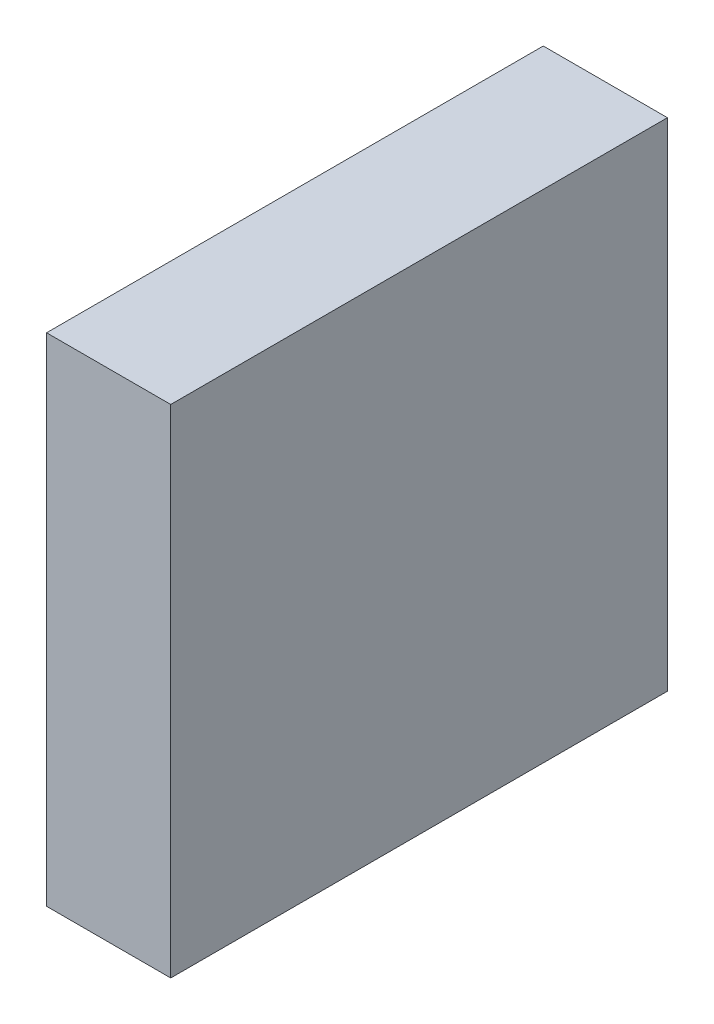
ISO-10303-21;
HEADER;
FILE_DESCRIPTION(('STEP AP214'),'2;1');
FILE_NAME('part.step','',(''),(''),'','','');
FILE_SCHEMA(('AUTOMOTIVE_DESIGN { 1 0 10303 214 1 1 1 1 }'));
ENDSEC;
DATA;
#1=APPLICATION_CONTEXT('core data for automotive mechanical design processes');
#2=APPLICATION_PROTOCOL_DEFINITION('international standard','automotive_design',2000,#1);
#3=PRODUCT_CONTEXT('',#1,'mechanical');
#4=PRODUCT('Part','Part','',(#3));
#5=PRODUCT_RELATED_PRODUCT_CATEGORY('part','',(#4));
#6=PRODUCT_DEFINITION_FORMATION('','',#4);
#7=PRODUCT_DEFINITION_CONTEXT('part definition',#1,'design');
#8=PRODUCT_DEFINITION('design','',#6,#7);
#9=PRODUCT_DEFINITION_SHAPE('','',#8);
#10=(LENGTH_UNIT() NAMED_UNIT(*) SI_UNIT(.MILLI.,.METRE.));
#11=(NAMED_UNIT(*) PLANE_ANGLE_UNIT() SI_UNIT($,.RADIAN.));
#12=(NAMED_UNIT(*) SI_UNIT($,.STERADIAN.) SOLID_ANGLE_UNIT());
#13=UNCERTAINTY_MEASURE_WITH_UNIT(LENGTH_MEASURE(1.E-05),#10,'distance_accuracy_value','');
#14=(GEOMETRIC_REPRESENTATION_CONTEXT(3) GLOBAL_UNCERTAINTY_ASSIGNED_CONTEXT((#13)) GLOBAL_UNIT_ASSIGNED_CONTEXT((#10,
#11,#12)) REPRESENTATION_CONTEXT('',''));
#15=CARTESIAN_POINT('',(0.,0.,0.));
#16=DIRECTION('',(0.,0.,1.));
#17=DIRECTION('',(1.,0.,0.));
#18=AXIS2_PLACEMENT_3D('',#15,#16,#17);
#19=CARTESIAN_POINT('',(5.,0.,0.));
#20=DIRECTION('',(0.,0.,-1.));
#21=DIRECTION('',(-1.,0.,0.));
#22=AXIS2_PLACEMENT_3D('',#19,#20,#21);
#23=PLANE('',#22);
#24=DIRECTION('',(0.,-1.,0.));
#25=VECTOR('',#24,1.);
#26=CARTESIAN_POINT('',(0.,0.,0.));
#27=LINE('',#26,#25);
#28=CARTESIAN_POINT('',(0.,20.,0.));
#29=VERTEX_POINT('',#28);
#30=CARTESIAN_POINT('',(0.,0.,0.));
#31=VERTEX_POINT('',#30);
#32=EDGE_CURVE('E98',#29,#31,#27,.T.);
#33=ORIENTED_EDGE('',*,*,#32,.T.);
#34=DIRECTION('',(-1.,0.,0.));
#35=VECTOR('',#34,1.);
#36=CARTESIAN_POINT('',(5.,0.,0.));
#37=LINE('',#36,#35);
#38=CARTESIAN_POINT('',(5.,0.,0.));
#39=VERTEX_POINT('',#38);
#40=EDGE_CURVE('E11',#39,#31,#37,.T.);
#41=ORIENTED_EDGE('',*,*,#40,.F.);
#42=DIRECTION('',(0.,-1.,0.));
#43=VECTOR('',#42,1.);
#44=CARTESIAN_POINT('',(5.,0.,0.));
#45=LINE('',#44,#43);
#46=CARTESIAN_POINT('',(5.,20.,0.));
#47=VERTEX_POINT('',#46);
#48=EDGE_CURVE('E86',#47,#39,#45,.T.);
#49=ORIENTED_EDGE('',*,*,#48,.F.);
#50=DIRECTION('',(-1.,0.,0.));
#51=VECTOR('',#50,1.);
#52=CARTESIAN_POINT('',(5.,20.,0.));
#53=LINE('',#52,#51);
#54=EDGE_CURVE('E94',#47,#29,#53,.T.);
#55=ORIENTED_EDGE('',*,*,#54,.T.);
#56=EDGE_LOOP('',(#33,#41,#49,#55));
#57=FACE_BOUND('',#56,.T.);
#58=ADVANCED_FACE('F35',(#57),#23,.F.);
#59=CARTESIAN_POINT('',(5.,0.,0.));
#60=DIRECTION('',(0.,1.,0.));
#61=DIRECTION('',(0.,0.,1.));
#62=AXIS2_PLACEMENT_3D('',#59,#60,#61);
#63=PLANE('',#62);
#64=DIRECTION('',(0.,0.,-1.));
#65=VECTOR('',#64,1.);
#66=CARTESIAN_POINT('',(0.,0.,0.));
#67=LINE('',#66,#65);
#68=CARTESIAN_POINT('',(0.,0.,-20.));
#69=VERTEX_POINT('',#68);
#70=EDGE_CURVE('E90',#31,#69,#67,.T.);
#71=ORIENTED_EDGE('',*,*,#70,.T.);
#72=DIRECTION('',(-1.,0.,0.));
#73=VECTOR('',#72,1.);
#74=CARTESIAN_POINT('',(5.,0.,-20.));
#75=LINE('',#74,#73);
#76=CARTESIAN_POINT('',(5.,0.,-20.));
#77=VERTEX_POINT('',#76);
#78=EDGE_CURVE('E43',#77,#69,#75,.T.);
#79=ORIENTED_EDGE('',*,*,#78,.F.);
#80=DIRECTION('',(0.,0.,-1.));
#81=VECTOR('',#80,1.);
#82=CARTESIAN_POINT('',(5.,0.,0.));
#83=LINE('',#82,#81);
#84=EDGE_CURVE('E81',#39,#77,#83,.T.);
#85=ORIENTED_EDGE('',*,*,#84,.F.);
#86=ORIENTED_EDGE('',*,*,#40,.T.);
#87=EDGE_LOOP('',(#71,#79,#85,#86));
#88=FACE_BOUND('',#87,.T.);
#89=ADVANCED_FACE('F89',(#88),#63,.F.);
#90=CARTESIAN_POINT('',(5.,0.,-20.));
#91=DIRECTION('',(0.,0.,1.));
#92=DIRECTION('',(1.,0.,0.));
#93=AXIS2_PLACEMENT_3D('',#90,#91,#92);
#94=PLANE('',#93);
#95=DIRECTION('',(0.,1.,0.));
#96=VECTOR('',#95,1.);
#97=CARTESIAN_POINT('',(0.,0.,-20.));
#98=LINE('',#97,#96);
#99=CARTESIAN_POINT('',(0.,20.,-20.));
#100=VERTEX_POINT('',#99);
#101=EDGE_CURVE('E68',#69,#100,#98,.T.);
#102=ORIENTED_EDGE('',*,*,#101,.T.);
#103=DIRECTION('',(-1.,0.,0.));
#104=VECTOR('',#103,1.);
#105=CARTESIAN_POINT('',(5.,20.,-20.));
#106=LINE('',#105,#104);
#107=CARTESIAN_POINT('',(5.,20.,-20.));
#108=VERTEX_POINT('',#107);
#109=EDGE_CURVE('E91',#108,#100,#106,.T.);
#110=ORIENTED_EDGE('',*,*,#109,.F.);
#111=DIRECTION('',(0.,1.,0.));
#112=VECTOR('',#111,1.);
#113=CARTESIAN_POINT('',(5.,0.,-20.));
#114=LINE('',#113,#112);
#115=EDGE_CURVE('E84',#77,#108,#114,.T.);
#116=ORIENTED_EDGE('',*,*,#115,.F.);
#117=ORIENTED_EDGE('',*,*,#78,.T.);
#118=EDGE_LOOP('',(#102,#110,#116,#117));
#119=FACE_BOUND('',#118,.T.);
#120=ADVANCED_FACE('F92',(#119),#94,.F.);
#121=CARTESIAN_POINT('',(5.,20.,0.));
#122=DIRECTION('',(0.,-1.,0.));
#123=DIRECTION('',(0.,0.,-1.));
#124=AXIS2_PLACEMENT_3D('',#121,#122,#123);
#125=PLANE('',#124);
#126=DIRECTION('',(0.,0.,1.));
#127=VECTOR('',#126,1.);
#128=CARTESIAN_POINT('',(0.,20.,0.));
#129=LINE('',#128,#127);
#130=EDGE_CURVE('E74',#100,#29,#129,.T.);
#131=ORIENTED_EDGE('',*,*,#130,.T.);
#132=ORIENTED_EDGE('',*,*,#54,.F.);
#133=DIRECTION('',(0.,0.,1.));
#134=VECTOR('',#133,1.);
#135=CARTESIAN_POINT('',(5.,20.,0.));
#136=LINE('',#135,#134);
#137=EDGE_CURVE('E51',#108,#47,#136,.T.);
#138=ORIENTED_EDGE('',*,*,#137,.F.);
#139=ORIENTED_EDGE('',*,*,#109,.T.);
#140=EDGE_LOOP('',(#131,#132,#138,#139));
#141=FACE_BOUND('',#140,.T.);
#142=ADVANCED_FACE('F105',(#141),#125,.F.);
#143=CARTESIAN_POINT('',(5.,0.,0.));
#144=DIRECTION('',(-1.,0.,0.));
#145=DIRECTION('',(0.,0.,1.));
#146=AXIS2_PLACEMENT_3D('',#143,#144,#145);
#147=PLANE('',#146);
#148=ORIENTED_EDGE('',*,*,#48,.T.);
#149=ORIENTED_EDGE('',*,*,#84,.T.);
#150=ORIENTED_EDGE('',*,*,#115,.T.);
#151=ORIENTED_EDGE('',*,*,#137,.T.);
#152=EDGE_LOOP('',(#148,#149,#150,#151));
#153=FACE_BOUND('',#152,.T.);
#154=ADVANCED_FACE('F82',(#153),#147,.F.);
#155=CARTESIAN_POINT('',(0.,0.,0.));
#156=DIRECTION('',(-1.,0.,0.));
#157=DIRECTION('',(0.,0.,1.));
#158=AXIS2_PLACEMENT_3D('',#155,#156,#157);
#159=PLANE('',#158);
#160=ORIENTED_EDGE('',*,*,#32,.F.);
#161=ORIENTED_EDGE('',*,*,#130,.F.);
#162=ORIENTED_EDGE('',*,*,#101,.F.);
#163=ORIENTED_EDGE('',*,*,#70,.F.);
#164=EDGE_LOOP('',(#160,#161,#162,#163));
#165=FACE_BOUND('',#164,.T.);
#166=ADVANCED_FACE('F108',(#165),#159,.T.);
#167=CLOSED_SHELL('',(#58,#89,#120,#142,#154,#166));
#168=MANIFOLD_SOLID_BREP('B2',#167);
#169=ADVANCED_BREP_SHAPE_REPRESENTATION('',(#18,#168),#14);
#170=SHAPE_DEFINITION_REPRESENTATION(#9,#169);
ENDSEC;
END-ISO-10303-21;
